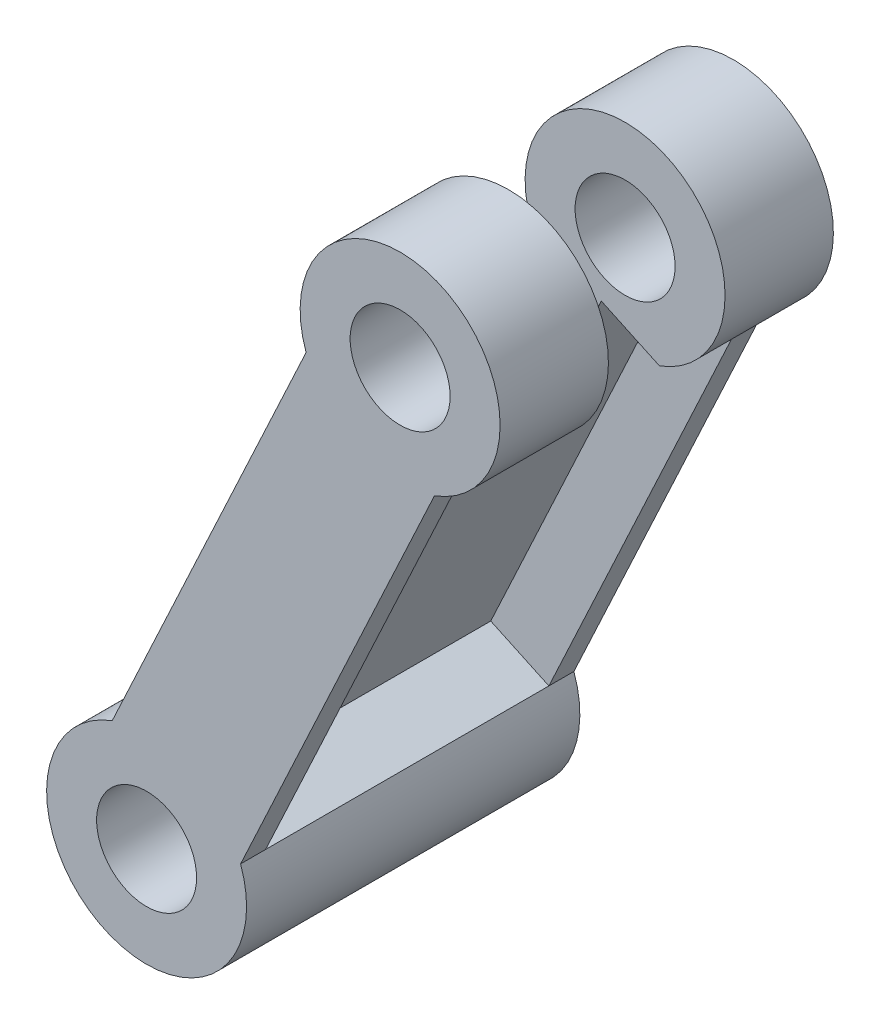
ISO-10303-21;
HEADER;
FILE_DESCRIPTION(('STEP AP214'),'2;1');
FILE_NAME('part.step','',(''),(''),'','','');
FILE_SCHEMA(('AUTOMOTIVE_DESIGN { 1 0 10303 214 1 1 1 1 }'));
ENDSEC;
DATA;
#1=APPLICATION_CONTEXT('core data for automotive mechanical design processes');
#2=APPLICATION_PROTOCOL_DEFINITION('international standard','automotive_design',2000,#1);
#3=PRODUCT_CONTEXT('',#1,'mechanical');
#4=PRODUCT('Part','Part','',(#3));
#5=PRODUCT_RELATED_PRODUCT_CATEGORY('part','',(#4));
#6=PRODUCT_DEFINITION_FORMATION('','',#4);
#7=PRODUCT_DEFINITION_CONTEXT('part definition',#1,'design');
#8=PRODUCT_DEFINITION('design','',#6,#7);
#9=PRODUCT_DEFINITION_SHAPE('','',#8);
#10=(LENGTH_UNIT() NAMED_UNIT(*) SI_UNIT(.MILLI.,.METRE.));
#11=(NAMED_UNIT(*) PLANE_ANGLE_UNIT() SI_UNIT($,.RADIAN.));
#12=(NAMED_UNIT(*) SI_UNIT($,.STERADIAN.) SOLID_ANGLE_UNIT());
#13=UNCERTAINTY_MEASURE_WITH_UNIT(LENGTH_MEASURE(1.E-05),#10,'distance_accuracy_value','');
#14=(GEOMETRIC_REPRESENTATION_CONTEXT(3) GLOBAL_UNCERTAINTY_ASSIGNED_CONTEXT((#13)) GLOBAL_UNIT_ASSIGNED_CONTEXT((#10,
#11,#12)) REPRESENTATION_CONTEXT('',''));
#15=CARTESIAN_POINT('',(0.,0.,0.));
#16=DIRECTION('',(0.,0.,1.));
#17=DIRECTION('',(1.,0.,0.));
#18=AXIS2_PLACEMENT_3D('',#15,#16,#17);
#19=CARTESIAN_POINT('',(38.5180809490576,-17.9612761239796,100.));
#20=DIRECTION('',(0.906307787036651,-0.422618261740697,0.));
#21=DIRECTION('',(0.422618261740697,0.906307787036651,0.));
#22=AXIS2_PLACEMENT_3D('',#19,#20,#21);
#23=PLANE('',#22);
#24=DIRECTION('',(0.,0.,-1.));
#25=VECTOR('',#24,1.);
#26=CARTESIAN_POINT('',(172.76163669529,269.924958207627,100.));
#27=LINE('',#26,#25);
#28=CARTESIAN_POINT('',(172.76163669529,269.924958207627,-85.));
#29=VERTEX_POINT('',#28);
#30=CARTESIAN_POINT('',(172.76163669529,269.924958207627,-100.));
#31=VERTEX_POINT('',#30);
#32=EDGE_CURVE('E339',#29,#31,#27,.T.);
#33=ORIENTED_EDGE('',*,*,#32,.F.);
#34=DIRECTION('',(-0.422618261740697,-0.906307787036651,0.));
#35=VECTOR('',#34,1.);
#36=CARTESIAN_POINT('',(56.4170994294767,20.4232928776077,-85.));
#37=LINE('',#36,#35);
#38=CARTESIAN_POINT('',(56.4170994294767,20.4232928776077,-85.));
#39=VERTEX_POINT('',#38);
#40=EDGE_CURVE('E196',#29,#39,#37,.T.);
#41=ORIENTED_EDGE('',*,*,#40,.T.);
#42=DIRECTION('',(0.,0.,-1.));
#43=VECTOR('',#42,1.);
#44=CARTESIAN_POINT('',(56.4170994294767,20.4232928776077,100.));
#45=LINE('',#44,#43);
#46=CARTESIAN_POINT('',(56.4170994294767,20.4232928776077,-100.));
#47=VERTEX_POINT('',#46);
#48=EDGE_CURVE('E320',#39,#47,#45,.T.);
#49=ORIENTED_EDGE('',*,*,#48,.T.);
#50=DIRECTION('',(-0.422618261740697,-0.906307787036651,0.));
#51=VECTOR('',#50,1.);
#52=CARTESIAN_POINT('',(38.5180809490576,-17.9612761239796,-100.));
#53=LINE('',#52,#51);
#54=EDGE_CURVE('E297',#31,#47,#53,.T.);
#55=ORIENTED_EDGE('',*,*,#54,.F.);
#56=EDGE_LOOP('',(#33,#41,#49,#55));
#57=FACE_BOUND('',#56,.T.);
#58=ADVANCED_FACE('F43',(#57),#23,.T.);
#59=CARTESIAN_POINT('',(56.4170994294767,20.4232928776077,100.));
#60=VERTEX_POINT('',#59);
#61=CARTESIAN_POINT('',(56.4170994294767,20.4232928776077,85.));
#62=VERTEX_POINT('',#61);
#63=EDGE_CURVE('E327',#60,#62,#45,.T.);
#64=ORIENTED_EDGE('',*,*,#63,.T.);
#65=DIRECTION('',(0.422618261740697,0.906307787036651,0.));
#66=VECTOR('',#65,1.);
#67=CARTESIAN_POINT('',(172.76163669529,269.924958207627,85.));
#68=LINE('',#67,#66);
#69=CARTESIAN_POINT('',(172.76163669529,269.924958207627,85.));
#70=VERTEX_POINT('',#69);
#71=EDGE_CURVE('E207',#62,#70,#68,.T.);
#72=ORIENTED_EDGE('',*,*,#71,.T.);
#73=CARTESIAN_POINT('',(172.76163669529,269.924958207627,100.));
#74=VERTEX_POINT('',#73);
#75=EDGE_CURVE('E344',#74,#70,#27,.T.);
#76=ORIENTED_EDGE('',*,*,#75,.F.);
#77=DIRECTION('',(-0.422618261740697,-0.906307787036651,0.));
#78=VECTOR('',#77,1.);
#79=CARTESIAN_POINT('',(38.5180809490576,-17.9612761239796,100.));
#80=LINE('',#79,#78);
#81=EDGE_CURVE('E310',#74,#60,#80,.T.);
#82=ORIENTED_EDGE('',*,*,#81,.T.);
#83=EDGE_LOOP('',(#64,#72,#76,#82));
#84=FACE_BOUND('',#83,.T.);
#85=ADVANCED_FACE('F406',(#84),#23,.T.);
#86=CARTESIAN_POINT('',(152.142574226651,326.270803333194,-35.));
#87=DIRECTION('',(0.,0.,1.));
#88=DIRECTION('',(1.,0.,0.));
#89=AXIS2_PLACEMENT_3D('',#86,#87,#88);
#90=PLANE('',#89);
#91=CARTESIAN_POINT('',(152.142574226651,326.270803333194,-35.));
#92=DIRECTION('',(0.,0.,1.));
#93=DIRECTION('',(1.,0.,0.));
#94=AXIS2_PLACEMENT_3D('',#91,#92,#93);
#95=CIRCLE('',#94,30.);
#96=CARTESIAN_POINT('',(182.142574226651,326.270803333194,-35.));
#97=VERTEX_POINT('',#96);
#98=EDGE_CURVE('E302',#97,#97,#95,.F.);
#99=ORIENTED_EDGE('',*,*,#98,.T.);
#100=EDGE_LOOP('',(#99));
#101=FACE_BOUND('',#100,.T.);
#102=DIRECTION('',(-0.422618261740697,-0.906307787036651,0.));
#103=VECTOR('',#102,1.);
#104=CARTESIAN_POINT('',(155.767805374798,324.580330286232,-35.));
#105=LINE('',#104,#103);
#106=CARTESIAN_POINT('',(137.868786894379,286.195761284644,-35.));
#107=VERTEX_POINT('',#106);
#108=CARTESIAN_POINT('',(118.850965116047,245.411910867995,-35.));
#109=VERTEX_POINT('',#108);
#110=EDGE_CURVE('E60',#107,#109,#105,.T.);
#111=ORIENTED_EDGE('',*,*,#110,.F.);
#112=DIRECTION('',(0.906307787036651,-0.422618261740698,0.));
#113=VECTOR('',#112,1.);
#114=CARTESIAN_POINT('',(134.243555746232,287.886234331607,-35.));
#115=LINE('',#114,#113);
#116=CARTESIAN_POINT('',(172.76163669529,269.924958207627,-35.));
#117=VERTEX_POINT('',#116);
#118=EDGE_CURVE('E184',#107,#117,#115,.T.);
#119=ORIENTED_EDGE('',*,*,#118,.T.);
#120=CARTESIAN_POINT('',(152.142574226651,326.270803333194,-35.));
#121=DIRECTION('',(0.,0.,1.));
#122=DIRECTION('',(1.,0.,0.));
#123=AXIS2_PLACEMENT_3D('',#120,#121,#122);
#124=CIRCLE('',#123,60.);
#125=CARTESIAN_POINT('',(95.7254747971743,305.847510455587,-35.));
#126=VERTEX_POINT('',#125);
#127=EDGE_CURVE('E287',#117,#126,#124,.T.);
#128=ORIENTED_EDGE('',*,*,#127,.T.);
#129=DIRECTION('',(-0.906307787036651,0.422618261740697,0.));
#130=VECTOR('',#129,1.);
#131=CARTESIAN_POINT('',(134.243555746232,287.886234331607,-35.));
#132=LINE('',#131,#130);
#133=CARTESIAN_POINT('',(130.618324598085,289.57670737857,-35.));
#134=VERTEX_POINT('',#133);
#135=EDGE_CURVE('E276',#134,#126,#132,.T.);
#136=ORIENTED_EDGE('',*,*,#135,.F.);
#137=DIRECTION('',(0.422618261740697,0.906307787036651,0.));
#138=VECTOR('',#137,1.);
#139=CARTESIAN_POINT('',(148.517343078504,327.961276380157,-35.));
#140=LINE('',#139,#138);
#141=CARTESIAN_POINT('',(111.600502819754,248.792856961921,-35.));
#142=VERTEX_POINT('',#141);
#143=EDGE_CURVE('E273',#142,#134,#140,.T.);
#144=ORIENTED_EDGE('',*,*,#143,.F.);
#145=DIRECTION('',(-0.906307787036651,0.422618261740697,0.));
#146=VECTOR('',#145,1.);
#147=CARTESIAN_POINT('',(312.459663474745,155.130692137914,-35.));
#148=LINE('',#147,#146);
#149=EDGE_CURVE('E278',#109,#142,#148,.T.);
#150=ORIENTED_EDGE('',*,*,#149,.F.);
#151=EDGE_LOOP('',(#111,#119,#128,#136,#144,#150));
#152=FACE_BOUND('',#151,.T.);
#153=ADVANCED_FACE('F359',(#101,#152),#90,.T.);
#154=CARTESIAN_POINT('',(152.142574226651,326.270803333194,35.));
#155=DIRECTION('',(0.,0.,1.));
#156=DIRECTION('',(1.,0.,0.));
#157=AXIS2_PLACEMENT_3D('',#154,#155,#156);
#158=PLANE('',#157);
#159=CARTESIAN_POINT('',(152.142574226651,326.270803333194,35.));
#160=DIRECTION('',(0.,0.,1.));
#161=DIRECTION('',(1.,0.,0.));
#162=AXIS2_PLACEMENT_3D('',#159,#160,#161);
#163=CIRCLE('',#162,30.);
#164=CARTESIAN_POINT('',(182.142574226651,326.270803333194,35.));
#165=VERTEX_POINT('',#164);
#166=EDGE_CURVE('E290',#165,#165,#163,.F.);
#167=ORIENTED_EDGE('',*,*,#166,.F.);
#168=EDGE_LOOP('',(#167));
#169=FACE_BOUND('',#168,.T.);
#170=DIRECTION('',(0.906307787036651,-0.422618261740698,0.));
#171=VECTOR('',#170,1.);
#172=CARTESIAN_POINT('',(134.243555746232,287.886234331607,35.));
#173=LINE('',#172,#171);
#174=CARTESIAN_POINT('',(137.868786894379,286.195761284644,35.));
#175=VERTEX_POINT('',#174);
#176=CARTESIAN_POINT('',(172.76163669529,269.924958207627,35.));
#177=VERTEX_POINT('',#176);
#178=EDGE_CURVE('E11',#175,#177,#173,.T.);
#179=ORIENTED_EDGE('',*,*,#178,.F.);
#180=DIRECTION('',(-0.422618261740697,-0.906307787036651,0.));
#181=VECTOR('',#180,1.);
#182=CARTESIAN_POINT('',(155.767805374798,324.580330286232,35.));
#183=LINE('',#182,#181);
#184=CARTESIAN_POINT('',(118.850965116047,245.411910867995,35.));
#185=VERTEX_POINT('',#184);
#186=EDGE_CURVE('E230',#175,#185,#183,.T.);
#187=ORIENTED_EDGE('',*,*,#186,.T.);
#188=DIRECTION('',(-0.906307787036651,0.422618261740697,0.));
#189=VECTOR('',#188,1.);
#190=CARTESIAN_POINT('',(312.459663474745,155.130692137914,35.));
#191=LINE('',#190,#189);
#192=CARTESIAN_POINT('',(111.600502819754,248.792856961921,35.));
#193=VERTEX_POINT('',#192);
#194=EDGE_CURVE('E277',#185,#193,#191,.T.);
#195=ORIENTED_EDGE('',*,*,#194,.T.);
#196=DIRECTION('',(0.422618261740697,0.906307787036651,0.));
#197=VECTOR('',#196,1.);
#198=CARTESIAN_POINT('',(148.517343078504,327.961276380157,35.));
#199=LINE('',#198,#197);
#200=CARTESIAN_POINT('',(130.618324598085,289.57670737857,35.));
#201=VERTEX_POINT('',#200);
#202=EDGE_CURVE('E275',#193,#201,#199,.T.);
#203=ORIENTED_EDGE('',*,*,#202,.T.);
#204=DIRECTION('',(-0.906307787036651,0.422618261740697,0.));
#205=VECTOR('',#204,1.);
#206=CARTESIAN_POINT('',(134.243555746232,287.886234331607,35.));
#207=LINE('',#206,#205);
#208=CARTESIAN_POINT('',(95.7254747971743,305.847510455587,35.));
#209=VERTEX_POINT('',#208);
#210=EDGE_CURVE('E352',#201,#209,#207,.T.);
#211=ORIENTED_EDGE('',*,*,#210,.T.);
#212=CARTESIAN_POINT('',(152.142574226651,326.270803333194,35.));
#213=DIRECTION('',(0.,0.,1.));
#214=DIRECTION('',(1.,0.,0.));
#215=AXIS2_PLACEMENT_3D('',#212,#213,#214);
#216=CIRCLE('',#215,60.);
#217=EDGE_CURVE('E285',#177,#209,#216,.T.);
#218=ORIENTED_EDGE('',*,*,#217,.F.);
#219=EDGE_LOOP('',(#179,#187,#195,#203,#211,#218));
#220=FACE_BOUND('',#219,.T.);
#221=ADVANCED_FACE('F388',(#169,#220),#158,.F.);
#222=CARTESIAN_POINT('',(-38.5180809490576,17.9612761239796,100.));
#223=DIRECTION('',(0.906307787036651,-0.422618261740697,0.));
#224=DIRECTION('',(0.422618261740697,0.906307787036651,0.));
#225=AXIS2_PLACEMENT_3D('',#222,#223,#224);
#226=PLANE('',#225);
#227=DIRECTION('',(0.,0.,-1.));
#228=VECTOR('',#227,1.);
#229=CARTESIAN_POINT('',(-20.6190624686386,56.345845125567,100.));
#230=LINE('',#229,#228);
#231=CARTESIAN_POINT('',(-20.6190624686386,56.345845125567,-85.));
#232=VERTEX_POINT('',#231);
#233=CARTESIAN_POINT('',(-20.6190624686386,56.345845125567,-100.));
#234=VERTEX_POINT('',#233);
#235=EDGE_CURVE('E331',#232,#234,#230,.T.);
#236=ORIENTED_EDGE('',*,*,#235,.F.);
#237=DIRECTION('',(-0.422618261740697,-0.906307787036651,0.));
#238=VECTOR('',#237,1.);
#239=CARTESIAN_POINT('',(-20.6190624686386,56.345845125567,-85.));
#240=LINE('',#239,#238);
#241=CARTESIAN_POINT('',(95.7254747971743,305.847510455587,-85.));
#242=VERTEX_POINT('',#241);
#243=EDGE_CURVE('E234',#242,#232,#240,.T.);
#244=ORIENTED_EDGE('',*,*,#243,.F.);
#245=DIRECTION('',(0.,0.,-1.));
#246=VECTOR('',#245,1.);
#247=CARTESIAN_POINT('',(95.7254747971743,305.847510455587,100.));
#248=LINE('',#247,#246);
#249=CARTESIAN_POINT('',(95.7254747971743,305.847510455587,-100.));
#250=VERTEX_POINT('',#249);
#251=EDGE_CURVE('E335',#242,#250,#248,.T.);
#252=ORIENTED_EDGE('',*,*,#251,.T.);
#253=DIRECTION('',(-0.422618261740697,-0.906307787036651,0.));
#254=VECTOR('',#253,1.);
#255=CARTESIAN_POINT('',(-38.5180809490576,17.9612761239796,-100.));
#256=LINE('',#255,#254);
#257=EDGE_CURVE('E325',#250,#234,#256,.T.);
#258=ORIENTED_EDGE('',*,*,#257,.T.);
#259=EDGE_LOOP('',(#236,#244,#252,#258));
#260=FACE_BOUND('',#259,.T.);
#261=ADVANCED_FACE('F426',(#260),#226,.F.);
#262=CARTESIAN_POINT('',(152.142574226651,326.270803333194,100.));
#263=DIRECTION('',(0.,0.,-1.));
#264=DIRECTION('',(-1.,0.,0.));
#265=AXIS2_PLACEMENT_3D('',#262,#263,#264);
#266=CYLINDRICAL_SURFACE('',#265,60.);
#267=ORIENTED_EDGE('',*,*,#127,.F.);
#268=EDGE_CURVE('E342',#117,#29,#27,.T.);
#269=ORIENTED_EDGE('',*,*,#268,.T.);
#270=ORIENTED_EDGE('',*,*,#32,.T.);
#271=CARTESIAN_POINT('',(152.142574226651,326.270803333194,-100.));
#272=DIRECTION('',(0.,0.,1.));
#273=DIRECTION('',(1.,0.,0.));
#274=AXIS2_PLACEMENT_3D('',#271,#272,#273);
#275=CIRCLE('',#274,60.);
#276=EDGE_CURVE('E318',#31,#250,#275,.T.);
#277=ORIENTED_EDGE('',*,*,#276,.T.);
#278=ORIENTED_EDGE('',*,*,#251,.F.);
#279=EDGE_CURVE('E338',#126,#242,#248,.T.);
#280=ORIENTED_EDGE('',*,*,#279,.F.);
#281=EDGE_LOOP('',(#267,#269,#270,#277,#278,#280));
#282=FACE_BOUND('',#281,.T.);
#283=ADVANCED_FACE('F425',(#282),#266,.T.);
#284=CARTESIAN_POINT('',(152.142574226651,326.270803333194,-100.));
#285=DIRECTION('',(0.,0.,1.));
#286=DIRECTION('',(1.,0.,0.));
#287=AXIS2_PLACEMENT_3D('',#284,#285,#286);
#288=CYLINDRICAL_SURFACE('',#287,30.);
#289=CARTESIAN_POINT('',(152.142574226651,326.270803333194,-100.));
#290=DIRECTION('',(0.,0.,1.));
#291=DIRECTION('',(1.,0.,0.));
#292=AXIS2_PLACEMENT_3D('',#289,#290,#291);
#293=CIRCLE('',#292,30.);
#294=CARTESIAN_POINT('',(182.142574226651,326.270803333194,-100.));
#295=VERTEX_POINT('',#294);
#296=EDGE_CURVE('E301',#295,#295,#293,.T.);
#297=ORIENTED_EDGE('',*,*,#296,.F.);
#298=EDGE_LOOP('',(#297));
#299=FACE_BOUND('',#298,.T.);
#300=ORIENTED_EDGE('',*,*,#98,.F.);
#301=EDGE_LOOP('',(#300));
#302=FACE_BOUND('',#301,.T.);
#303=ADVANCED_FACE('F480',(#299,#302),#288,.F.);
#304=ORIENTED_EDGE('',*,*,#75,.T.);
#305=DIRECTION('',(0.,0.,-1.));
#306=VECTOR('',#305,1.);
#307=CARTESIAN_POINT('',(172.76163669529,269.924958207627,-85.));
#308=LINE('',#307,#306);
#309=EDGE_CURVE('E213',#70,#177,#308,.T.);
#310=ORIENTED_EDGE('',*,*,#309,.T.);
#311=ORIENTED_EDGE('',*,*,#217,.T.);
#312=DIRECTION('',(0.,0.,-1.));
#313=VECTOR('',#312,1.);
#314=CARTESIAN_POINT('',(95.7254747971743,305.847510455587,-85.));
#315=LINE('',#314,#313);
#316=CARTESIAN_POINT('',(95.7254747971743,305.847510455587,85.));
#317=VERTEX_POINT('',#316);
#318=EDGE_CURVE('E237',#317,#209,#315,.T.);
#319=ORIENTED_EDGE('',*,*,#318,.F.);
#320=CARTESIAN_POINT('',(95.7254747971743,305.847510455587,100.));
#321=VERTEX_POINT('',#320);
#322=EDGE_CURVE('E337',#321,#317,#248,.T.);
#323=ORIENTED_EDGE('',*,*,#322,.F.);
#324=CARTESIAN_POINT('',(152.142574226651,326.270803333194,100.));
#325=DIRECTION('',(0.,0.,1.));
#326=DIRECTION('',(1.,0.,0.));
#327=AXIS2_PLACEMENT_3D('',#324,#325,#326);
#328=CIRCLE('',#327,60.);
#329=EDGE_CURVE('E309',#74,#321,#328,.T.);
#330=ORIENTED_EDGE('',*,*,#329,.F.);
#331=EDGE_LOOP('',(#304,#310,#311,#319,#323,#330));
#332=FACE_BOUND('',#331,.T.);
#333=ADVANCED_FACE('F405',(#332),#266,.T.);
#334=ORIENTED_EDGE('',*,*,#322,.T.);
#335=DIRECTION('',(0.422618261740697,0.906307787036651,0.));
#336=VECTOR('',#335,1.);
#337=CARTESIAN_POINT('',(95.7254747971743,305.847510455587,85.));
#338=LINE('',#337,#336);
#339=CARTESIAN_POINT('',(-20.6190624686386,56.345845125567,85.));
#340=VERTEX_POINT('',#339);
#341=EDGE_CURVE('E253',#340,#317,#338,.T.);
#342=ORIENTED_EDGE('',*,*,#341,.F.);
#343=CARTESIAN_POINT('',(-20.6190624686386,56.345845125567,100.));
#344=VERTEX_POINT('',#343);
#345=EDGE_CURVE('E332',#344,#340,#230,.T.);
#346=ORIENTED_EDGE('',*,*,#345,.F.);
#347=DIRECTION('',(-0.422618261740697,-0.906307787036651,0.));
#348=VECTOR('',#347,1.);
#349=CARTESIAN_POINT('',(-38.5180809490576,17.9612761239796,100.));
#350=LINE('',#349,#348);
#351=EDGE_CURVE('E312',#321,#344,#350,.T.);
#352=ORIENTED_EDGE('',*,*,#351,.F.);
#353=EDGE_LOOP('',(#334,#342,#346,#352));
#354=FACE_BOUND('',#353,.T.);
#355=ADVANCED_FACE('F436',(#354),#226,.F.);
#356=CARTESIAN_POINT('',(0.,0.,100.));
#357=DIRECTION('',(0.,0.,-1.));
#358=DIRECTION('',(-1.,0.,0.));
#359=AXIS2_PLACEMENT_3D('',#356,#357,#358);
#360=CYLINDRICAL_SURFACE('',#359,60.);
#361=CARTESIAN_POINT('',(0.,0.,-100.));
#362=DIRECTION('',(0.,0.,1.));
#363=DIRECTION('',(1.,0.,0.));
#364=AXIS2_PLACEMENT_3D('',#361,#362,#363);
#365=CIRCLE('',#364,60.);
#366=EDGE_CURVE('E311',#234,#47,#365,.T.);
#367=ORIENTED_EDGE('',*,*,#366,.T.);
#368=ORIENTED_EDGE('',*,*,#48,.F.);
#369=DIRECTION('',(0.,0.,1.));
#370=VECTOR('',#369,1.);
#371=CARTESIAN_POINT('',(56.4170994294767,20.4232928776077,85.));
#372=LINE('',#371,#370);
#373=EDGE_CURVE('E204',#39,#62,#372,.T.);
#374=ORIENTED_EDGE('',*,*,#373,.T.);
#375=ORIENTED_EDGE('',*,*,#63,.F.);
#376=CARTESIAN_POINT('',(0.,0.,100.));
#377=DIRECTION('',(0.,0.,1.));
#378=DIRECTION('',(1.,0.,0.));
#379=AXIS2_PLACEMENT_3D('',#376,#377,#378);
#380=CIRCLE('',#379,60.);
#381=EDGE_CURVE('E314',#344,#60,#380,.T.);
#382=ORIENTED_EDGE('',*,*,#381,.F.);
#383=ORIENTED_EDGE('',*,*,#345,.T.);
#384=DIRECTION('',(0.,0.,1.));
#385=VECTOR('',#384,1.);
#386=CARTESIAN_POINT('',(-20.6190624686386,56.345845125567,85.));
#387=LINE('',#386,#385);
#388=EDGE_CURVE('E255',#232,#340,#387,.T.);
#389=ORIENTED_EDGE('',*,*,#388,.F.);
#390=ORIENTED_EDGE('',*,*,#235,.T.);
#391=EDGE_LOOP('',(#367,#368,#374,#375,#382,#383,#389,#390));
#392=FACE_BOUND('',#391,.T.);
#393=ADVANCED_FACE('F413',(#392),#360,.T.);
#394=CARTESIAN_POINT('',(0.,0.,100.));
#395=DIRECTION('',(0.,0.,1.));
#396=DIRECTION('',(1.,0.,0.));
#397=AXIS2_PLACEMENT_3D('',#394,#395,#396);
#398=PLANE('',#397);
#399=CARTESIAN_POINT('',(0.,0.,100.));
#400=DIRECTION('',(0.,0.,1.));
#401=DIRECTION('',(1.,0.,0.));
#402=AXIS2_PLACEMENT_3D('',#399,#400,#401);
#403=CIRCLE('',#402,30.);
#404=CARTESIAN_POINT('',(30.,0.,100.));
#405=VERTEX_POINT('',#404);
#406=EDGE_CURVE('E291',#405,#405,#403,.T.);
#407=ORIENTED_EDGE('',*,*,#406,.F.);
#408=EDGE_LOOP('',(#407));
#409=FACE_BOUND('',#408,.T.);
#410=CARTESIAN_POINT('',(152.142574226651,326.270803333194,100.));
#411=DIRECTION('',(0.,0.,1.));
#412=DIRECTION('',(1.,0.,0.));
#413=AXIS2_PLACEMENT_3D('',#410,#411,#412);
#414=CIRCLE('',#413,30.);
#415=CARTESIAN_POINT('',(182.142574226651,326.270803333194,100.));
#416=VERTEX_POINT('',#415);
#417=EDGE_CURVE('E300',#416,#416,#414,.T.);
#418=ORIENTED_EDGE('',*,*,#417,.F.);
#419=EDGE_LOOP('',(#418));
#420=FACE_BOUND('',#419,.T.);
#421=ORIENTED_EDGE('',*,*,#81,.F.);
#422=ORIENTED_EDGE('',*,*,#329,.T.);
#423=ORIENTED_EDGE('',*,*,#351,.T.);
#424=ORIENTED_EDGE('',*,*,#381,.T.);
#425=EDGE_LOOP('',(#421,#422,#423,#424));
#426=FACE_BOUND('',#425,.T.);
#427=ADVANCED_FACE('F437',(#409,#420,#426),#398,.T.);
#428=CARTESIAN_POINT('',(0.,0.,-100.));
#429=DIRECTION('',(0.,0.,1.));
#430=DIRECTION('',(1.,0.,0.));
#431=AXIS2_PLACEMENT_3D('',#428,#429,#430);
#432=PLANE('',#431);
#433=CARTESIAN_POINT('',(0.,0.,-100.));
#434=DIRECTION('',(0.,0.,1.));
#435=DIRECTION('',(1.,0.,0.));
#436=AXIS2_PLACEMENT_3D('',#433,#434,#435);
#437=CIRCLE('',#436,30.);
#438=CARTESIAN_POINT('',(30.,0.,-100.));
#439=VERTEX_POINT('',#438);
#440=EDGE_CURVE('E298',#439,#439,#437,.T.);
#441=ORIENTED_EDGE('',*,*,#440,.T.);
#442=EDGE_LOOP('',(#441));
#443=FACE_BOUND('',#442,.T.);
#444=ORIENTED_EDGE('',*,*,#296,.T.);
#445=EDGE_LOOP('',(#444));
#446=FACE_BOUND('',#445,.T.);
#447=ORIENTED_EDGE('',*,*,#54,.T.);
#448=ORIENTED_EDGE('',*,*,#366,.F.);
#449=ORIENTED_EDGE('',*,*,#257,.F.);
#450=ORIENTED_EDGE('',*,*,#276,.F.);
#451=EDGE_LOOP('',(#447,#448,#449,#450));
#452=FACE_BOUND('',#451,.T.);
#453=ADVANCED_FACE('F435',(#443,#446,#452),#432,.F.);
#454=ORIENTED_EDGE('',*,*,#166,.T.);
#455=EDGE_LOOP('',(#454));
#456=FACE_BOUND('',#455,.T.);
#457=ORIENTED_EDGE('',*,*,#417,.T.);
#458=EDGE_LOOP('',(#457));
#459=FACE_BOUND('',#458,.T.);
#460=ADVANCED_FACE('F447',(#456,#459),#288,.F.);
#461=CARTESIAN_POINT('',(0.,0.,-100.));
#462=DIRECTION('',(0.,0.,1.));
#463=DIRECTION('',(1.,0.,0.));
#464=AXIS2_PLACEMENT_3D('',#461,#462,#463);
#465=CYLINDRICAL_SURFACE('',#464,30.);
#466=ORIENTED_EDGE('',*,*,#440,.F.);
#467=EDGE_LOOP('',(#466));
#468=FACE_BOUND('',#467,.T.);
#469=ORIENTED_EDGE('',*,*,#406,.T.);
#470=EDGE_LOOP('',(#469));
#471=FACE_BOUND('',#470,.T.);
#472=ADVANCED_FACE('F471',(#468,#471),#465,.F.);
#473=CARTESIAN_POINT('',(312.459663474745,155.130692137914,25.));
#474=DIRECTION('',(-0.906307787036651,0.422618261740697,0.));
#475=DIRECTION('',(-0.422618261740697,-0.906307787036651,0.));
#476=AXIS2_PLACEMENT_3D('',#473,#474,#475);
#477=CYLINDRICAL_SURFACE('',#476,10.);
#478=ORIENTED_EDGE('',*,*,#194,.F.);
#479=CARTESIAN_POINT('',(118.850965116047,245.411910867995,25.));
#480=DIRECTION('',(-0.906307787036651,0.422618261740697,0.));
#481=DIRECTION('',(-0.422618261740697,-0.906307787036651,0.));
#482=AXIS2_PLACEMENT_3D('',#479,#480,#481);
#483=CIRCLE('',#482,10.);
#484=CARTESIAN_POINT('',(114.62478249864,236.348832997628,24.9999999999999));
#485=VERTEX_POINT('',#484);
#486=EDGE_CURVE('E228',#185,#485,#483,.F.);
#487=ORIENTED_EDGE('',*,*,#486,.T.);
#488=DIRECTION('',(-0.906307787036651,0.422618261740697,0.));
#489=VECTOR('',#488,1.);
#490=CARTESIAN_POINT('',(308.233480857338,146.067614267547,24.9999999999999));
#491=LINE('',#490,#489);
#492=CARTESIAN_POINT('',(107.374320202347,239.729779091554,24.9999999999999));
#493=VERTEX_POINT('',#492);
#494=EDGE_CURVE('E282',#485,#493,#491,.T.);
#495=ORIENTED_EDGE('',*,*,#494,.T.);
#496=CARTESIAN_POINT('',(111.600502819754,248.792856961921,25.));
#497=DIRECTION('',(0.906307787036651,-0.422618261740697,0.));
#498=DIRECTION('',(0.422618261740697,0.906307787036651,0.));
#499=AXIS2_PLACEMENT_3D('',#496,#497,#498);
#500=CIRCLE('',#499,10.);
#501=EDGE_CURVE('E268',#493,#193,#500,.F.);
#502=ORIENTED_EDGE('',*,*,#501,.T.);
#503=EDGE_LOOP('',(#478,#487,#495,#502));
#504=FACE_BOUND('',#503,.T.);
#505=ADVANCED_FACE('F392',(#504),#477,.F.);
#506=CARTESIAN_POINT('',(308.233480857338,146.067614267547,24.9999999999999));
#507=DIRECTION('',(-0.422618261740697,-0.906307787036651,0.));
#508=DIRECTION('',(0.906307787036651,-0.422618261740697,0.));
#509=AXIS2_PLACEMENT_3D('',#506,#507,#508);
#510=PLANE('',#509);
#511=ORIENTED_EDGE('',*,*,#494,.F.);
#512=DIRECTION('',(0.,0.,-1.));
#513=VECTOR('',#512,1.);
#514=CARTESIAN_POINT('',(114.62478249864,236.348832997628,24.9999999999999));
#515=LINE('',#514,#513);
#516=CARTESIAN_POINT('',(114.62478249864,236.348832997628,-25.));
#517=VERTEX_POINT('',#516);
#518=EDGE_CURVE('E221',#485,#517,#515,.T.);
#519=ORIENTED_EDGE('',*,*,#518,.T.);
#520=DIRECTION('',(-0.906307787036651,0.422618261740697,0.));
#521=VECTOR('',#520,1.);
#522=CARTESIAN_POINT('',(308.233480857338,146.067614267547,-25.));
#523=LINE('',#522,#521);
#524=CARTESIAN_POINT('',(107.374320202347,239.729779091554,-25.));
#525=VERTEX_POINT('',#524);
#526=EDGE_CURVE('E62',#517,#525,#523,.T.);
#527=ORIENTED_EDGE('',*,*,#526,.T.);
#528=DIRECTION('',(0.,0.,1.));
#529=VECTOR('',#528,1.);
#530=CARTESIAN_POINT('',(107.374320202347,239.729779091554,24.9999999999999));
#531=LINE('',#530,#529);
#532=EDGE_CURVE('E265',#525,#493,#531,.T.);
#533=ORIENTED_EDGE('',*,*,#532,.T.);
#534=EDGE_LOOP('',(#511,#519,#527,#533));
#535=FACE_BOUND('',#534,.T.);
#536=ADVANCED_FACE('F394',(#535),#510,.F.);
#537=CARTESIAN_POINT('',(312.459663474745,155.130692137914,-25.));
#538=DIRECTION('',(-0.906307787036651,0.422618261740697,0.));
#539=DIRECTION('',(-0.422618261740697,-0.906307787036651,0.));
#540=AXIS2_PLACEMENT_3D('',#537,#538,#539);
#541=CYLINDRICAL_SURFACE('',#540,10.);
#542=ORIENTED_EDGE('',*,*,#526,.F.);
#543=CARTESIAN_POINT('',(118.850965116047,245.411910867995,-25.));
#544=DIRECTION('',(-0.906307787036651,0.422618261740697,0.));
#545=DIRECTION('',(-0.422618261740697,-0.906307787036651,0.));
#546=AXIS2_PLACEMENT_3D('',#543,#544,#545);
#547=CIRCLE('',#546,10.);
#548=EDGE_CURVE('E49',#517,#109,#547,.F.);
#549=ORIENTED_EDGE('',*,*,#548,.T.);
#550=ORIENTED_EDGE('',*,*,#149,.T.);
#551=CARTESIAN_POINT('',(111.600502819754,248.792856961921,-25.));
#552=DIRECTION('',(0.906307787036651,-0.422618261740697,0.));
#553=DIRECTION('',(0.422618261740697,0.906307787036651,0.));
#554=AXIS2_PLACEMENT_3D('',#551,#552,#553);
#555=CIRCLE('',#554,10.);
#556=EDGE_CURVE('E343',#142,#525,#555,.F.);
#557=ORIENTED_EDGE('',*,*,#556,.T.);
#558=EDGE_LOOP('',(#542,#549,#550,#557));
#559=FACE_BOUND('',#558,.T.);
#560=ADVANCED_FACE('F358',(#559),#541,.F.);
#561=CARTESIAN_POINT('',(130.618324598085,289.57670737857,-85.));
#562=DIRECTION('',(0.422618261740697,0.906307787036651,0.));
#563=DIRECTION('',(-0.906307787036651,0.422618261740697,0.));
#564=AXIS2_PLACEMENT_3D('',#561,#562,#563);
#565=PLANE('',#564);
#566=DIRECTION('',(0.,0.,-1.));
#567=VECTOR('',#566,1.);
#568=CARTESIAN_POINT('',(130.618324598085,289.57670737857,-85.));
#569=LINE('',#568,#567);
#570=CARTESIAN_POINT('',(130.618324598085,289.57670737857,85.));
#571=VERTEX_POINT('',#570);
#572=EDGE_CURVE('E246',#571,#201,#569,.T.);
#573=ORIENTED_EDGE('',*,*,#572,.F.);
#574=DIRECTION('',(-0.906307787036651,0.422618261740697,0.));
#575=VECTOR('',#574,1.);
#576=CARTESIAN_POINT('',(130.618324598085,289.57670737857,85.));
#577=LINE('',#576,#575);
#578=EDGE_CURVE('E262',#571,#317,#577,.T.);
#579=ORIENTED_EDGE('',*,*,#578,.T.);
#580=ORIENTED_EDGE('',*,*,#318,.T.);
#581=ORIENTED_EDGE('',*,*,#210,.F.);
#582=EDGE_LOOP('',(#573,#579,#580,#581));
#583=FACE_BOUND('',#582,.T.);
#584=ADVANCED_FACE('F381',(#583),#565,.F.);
#585=CARTESIAN_POINT('',(14.2737873322724,40.0750420485501,-85.));
#586=DIRECTION('',(0.,0.,-1.));
#587=DIRECTION('',(0.,1.,0.));
#588=AXIS2_PLACEMENT_3D('',#585,#586,#587);
#589=PLANE('',#588);
#590=ORIENTED_EDGE('',*,*,#243,.T.);
#591=DIRECTION('',(-0.906307787036651,0.422618261740697,0.));
#592=VECTOR('',#591,1.);
#593=CARTESIAN_POINT('',(14.2737873322724,40.0750420485501,-85.));
#594=LINE('',#593,#592);
#595=CARTESIAN_POINT('',(14.2737873322724,40.0750420485501,-85.));
#596=VERTEX_POINT('',#595);
#597=EDGE_CURVE('E248',#596,#232,#594,.T.);
#598=ORIENTED_EDGE('',*,*,#597,.F.);
#599=DIRECTION('',(-0.422618261740697,-0.906307787036651,0.));
#600=VECTOR('',#599,1.);
#601=CARTESIAN_POINT('',(14.2737873322724,40.0750420485501,-85.));
#602=LINE('',#601,#600);
#603=CARTESIAN_POINT('',(130.618324598085,289.57670737857,-85.));
#604=VERTEX_POINT('',#603);
#605=EDGE_CURVE('E232',#604,#596,#602,.T.);
#606=ORIENTED_EDGE('',*,*,#605,.F.);
#607=DIRECTION('',(-0.906307787036651,0.422618261740697,0.));
#608=VECTOR('',#607,1.);
#609=CARTESIAN_POINT('',(130.618324598085,289.57670737857,-85.));
#610=LINE('',#609,#608);
#611=EDGE_CURVE('E258',#604,#242,#610,.T.);
#612=ORIENTED_EDGE('',*,*,#611,.T.);
#613=EDGE_LOOP('',(#590,#598,#606,#612));
#614=FACE_BOUND('',#613,.T.);
#615=ADVANCED_FACE('F375',(#614),#589,.F.);
#616=ORIENTED_EDGE('',*,*,#135,.T.);
#617=ORIENTED_EDGE('',*,*,#279,.T.);
#618=ORIENTED_EDGE('',*,*,#611,.F.);
#619=EDGE_CURVE('E244',#134,#604,#569,.T.);
#620=ORIENTED_EDGE('',*,*,#619,.F.);
#621=EDGE_LOOP('',(#616,#617,#618,#620));
#622=FACE_BOUND('',#621,.T.);
#623=ADVANCED_FACE('F370',(#622),#565,.F.);
#624=CARTESIAN_POINT('',(130.618324598085,289.57670737857,85.));
#625=DIRECTION('',(0.,0.,1.));
#626=DIRECTION('',(0.,-1.,0.));
#627=AXIS2_PLACEMENT_3D('',#624,#625,#626);
#628=PLANE('',#627);
#629=ORIENTED_EDGE('',*,*,#341,.T.);
#630=ORIENTED_EDGE('',*,*,#578,.F.);
#631=DIRECTION('',(0.422618261740697,0.906307787036651,0.));
#632=VECTOR('',#631,1.);
#633=CARTESIAN_POINT('',(130.618324598085,289.57670737857,85.));
#634=LINE('',#633,#632);
#635=CARTESIAN_POINT('',(14.2737873322724,40.0750420485501,85.));
#636=VERTEX_POINT('',#635);
#637=EDGE_CURVE('E245',#636,#571,#634,.T.);
#638=ORIENTED_EDGE('',*,*,#637,.F.);
#639=DIRECTION('',(-0.906307787036651,0.422618261740697,0.));
#640=VECTOR('',#639,1.);
#641=CARTESIAN_POINT('',(14.2737873322724,40.0750420485501,85.));
#642=LINE('',#641,#640);
#643=EDGE_CURVE('E264',#636,#340,#642,.T.);
#644=ORIENTED_EDGE('',*,*,#643,.T.);
#645=EDGE_LOOP('',(#629,#630,#638,#644));
#646=FACE_BOUND('',#645,.T.);
#647=ADVANCED_FACE('F382',(#646),#628,.F.);
#648=CARTESIAN_POINT('',(14.2737873322724,40.0750420485501,85.));
#649=DIRECTION('',(-0.422618261740697,-0.906307787036651,0.));
#650=DIRECTION('',(0.906307787036651,-0.422618261740697,0.));
#651=AXIS2_PLACEMENT_3D('',#648,#649,#650);
#652=PLANE('',#651);
#653=ORIENTED_EDGE('',*,*,#388,.T.);
#654=ORIENTED_EDGE('',*,*,#643,.F.);
#655=DIRECTION('',(0.,0.,1.));
#656=VECTOR('',#655,1.);
#657=CARTESIAN_POINT('',(14.2737873322724,40.0750420485501,85.));
#658=LINE('',#657,#656);
#659=EDGE_CURVE('E238',#596,#636,#658,.T.);
#660=ORIENTED_EDGE('',*,*,#659,.F.);
#661=ORIENTED_EDGE('',*,*,#597,.T.);
#662=EDGE_LOOP('',(#653,#654,#660,#661));
#663=FACE_BOUND('',#662,.T.);
#664=ADVANCED_FACE('F380',(#663),#652,.F.);
#665=CARTESIAN_POINT('',(-3.62523114814661,1.69047304696279,0.));
#666=DIRECTION('',(0.906307787036651,-0.422618261740697,0.));
#667=DIRECTION('',(0.422618261740697,0.906307787036651,0.));
#668=AXIS2_PLACEMENT_3D('',#665,#666,#667);
#669=PLANE('',#668);
#670=ORIENTED_EDGE('',*,*,#143,.T.);
#671=ORIENTED_EDGE('',*,*,#619,.T.);
#672=ORIENTED_EDGE('',*,*,#605,.T.);
#673=ORIENTED_EDGE('',*,*,#659,.T.);
#674=ORIENTED_EDGE('',*,*,#637,.T.);
#675=ORIENTED_EDGE('',*,*,#572,.T.);
#676=ORIENTED_EDGE('',*,*,#202,.F.);
#677=ORIENTED_EDGE('',*,*,#501,.F.);
#678=ORIENTED_EDGE('',*,*,#532,.F.);
#679=ORIENTED_EDGE('',*,*,#556,.F.);
#680=EDGE_LOOP('',(#670,#671,#672,#673,#674,#675,#676,#677,#678,#679));
#681=FACE_BOUND('',#680,.T.);
#682=ADVANCED_FACE('F364',(#681),#669,.F.);
#683=CARTESIAN_POINT('',(137.868786894379,286.195761284644,-85.));
#684=DIRECTION('',(-0.422618261740697,-0.906307787036651,0.));
#685=DIRECTION('',(0.906307787036651,-0.422618261740698,0.));
#686=AXIS2_PLACEMENT_3D('',#683,#684,#685);
#687=PLANE('',#686);
#688=ORIENTED_EDGE('',*,*,#178,.T.);
#689=ORIENTED_EDGE('',*,*,#309,.F.);
#690=DIRECTION('',(0.906307787036651,-0.422618261740697,0.));
#691=VECTOR('',#690,1.);
#692=CARTESIAN_POINT('',(137.868786894379,286.195761284644,85.));
#693=LINE('',#692,#691);
#694=CARTESIAN_POINT('',(137.868786894379,286.195761284644,85.));
#695=VERTEX_POINT('',#694);
#696=EDGE_CURVE('E197',#695,#70,#693,.T.);
#697=ORIENTED_EDGE('',*,*,#696,.F.);
#698=DIRECTION('',(0.,0.,-1.));
#699=VECTOR('',#698,1.);
#700=CARTESIAN_POINT('',(137.868786894379,286.195761284644,-85.));
#701=LINE('',#700,#699);
#702=EDGE_CURVE('E190',#695,#175,#701,.T.);
#703=ORIENTED_EDGE('',*,*,#702,.T.);
#704=EDGE_LOOP('',(#688,#689,#697,#703));
#705=FACE_BOUND('',#704,.T.);
#706=ADVANCED_FACE('F398',(#705),#687,.T.);
#707=CARTESIAN_POINT('',(21.5242496285656,36.6940959546246,-85.));
#708=DIRECTION('',(0.,0.,1.));
#709=DIRECTION('',(0.,-1.,0.));
#710=AXIS2_PLACEMENT_3D('',#707,#708,#709);
#711=PLANE('',#710);
#712=ORIENTED_EDGE('',*,*,#40,.F.);
#713=DIRECTION('',(0.906307787036651,-0.422618261740697,0.));
#714=VECTOR('',#713,1.);
#715=CARTESIAN_POINT('',(137.868786894379,286.195761284644,-85.));
#716=LINE('',#715,#714);
#717=CARTESIAN_POINT('',(137.868786894379,286.195761284644,-85.));
#718=VERTEX_POINT('',#717);
#719=EDGE_CURVE('E185',#718,#29,#716,.T.);
#720=ORIENTED_EDGE('',*,*,#719,.F.);
#721=DIRECTION('',(-0.422618261740697,-0.906307787036651,0.));
#722=VECTOR('',#721,1.);
#723=CARTESIAN_POINT('',(21.5242496285656,36.6940959546246,-85.));
#724=LINE('',#723,#722);
#725=CARTESIAN_POINT('',(21.5242496285656,36.6940959546246,-85.));
#726=VERTEX_POINT('',#725);
#727=EDGE_CURVE('E189',#718,#726,#724,.T.);
#728=ORIENTED_EDGE('',*,*,#727,.T.);
#729=DIRECTION('',(0.906307787036651,-0.422618261740697,0.));
#730=VECTOR('',#729,1.);
#731=CARTESIAN_POINT('',(21.5242496285656,36.6940959546246,-85.));
#732=LINE('',#731,#730);
#733=EDGE_CURVE('E218',#726,#39,#732,.T.);
#734=ORIENTED_EDGE('',*,*,#733,.T.);
#735=EDGE_LOOP('',(#712,#720,#728,#734));
#736=FACE_BOUND('',#735,.T.);
#737=ADVANCED_FACE('F191',(#736),#711,.T.);
#738=CARTESIAN_POINT('',(21.5242496285656,36.6940959546246,85.));
#739=DIRECTION('',(0.422618261740697,0.906307787036651,0.));
#740=DIRECTION('',(-0.906307787036651,0.422618261740698,0.));
#741=AXIS2_PLACEMENT_3D('',#738,#739,#740);
#742=PLANE('',#741);
#743=ORIENTED_EDGE('',*,*,#373,.F.);
#744=ORIENTED_EDGE('',*,*,#733,.F.);
#745=DIRECTION('',(0.,0.,1.));
#746=VECTOR('',#745,1.);
#747=CARTESIAN_POINT('',(21.5242496285656,36.6940959546246,85.));
#748=LINE('',#747,#746);
#749=CARTESIAN_POINT('',(21.5242496285656,36.6940959546246,85.));
#750=VERTEX_POINT('',#749);
#751=EDGE_CURVE('E198',#726,#750,#748,.T.);
#752=ORIENTED_EDGE('',*,*,#751,.T.);
#753=DIRECTION('',(0.906307787036651,-0.422618261740697,0.));
#754=VECTOR('',#753,1.);
#755=CARTESIAN_POINT('',(21.5242496285656,36.6940959546246,85.));
#756=LINE('',#755,#754);
#757=EDGE_CURVE('E222',#750,#62,#756,.T.);
#758=ORIENTED_EDGE('',*,*,#757,.T.);
#759=EDGE_LOOP('',(#743,#744,#752,#758));
#760=FACE_BOUND('',#759,.T.);
#761=ADVANCED_FACE('F417',(#760),#742,.T.);
#762=CARTESIAN_POINT('',(137.868786894379,286.195761284644,85.));
#763=DIRECTION('',(0.,0.,-1.));
#764=DIRECTION('',(0.,1.,0.));
#765=AXIS2_PLACEMENT_3D('',#762,#763,#764);
#766=PLANE('',#765);
#767=ORIENTED_EDGE('',*,*,#71,.F.);
#768=ORIENTED_EDGE('',*,*,#757,.F.);
#769=DIRECTION('',(0.422618261740697,0.906307787036651,0.));
#770=VECTOR('',#769,1.);
#771=CARTESIAN_POINT('',(137.868786894379,286.195761284644,85.));
#772=LINE('',#771,#770);
#773=EDGE_CURVE('E208',#750,#695,#772,.T.);
#774=ORIENTED_EDGE('',*,*,#773,.T.);
#775=ORIENTED_EDGE('',*,*,#696,.T.);
#776=EDGE_LOOP('',(#767,#768,#774,#775));
#777=FACE_BOUND('',#776,.T.);
#778=ADVANCED_FACE('F411',(#777),#766,.T.);
#779=EDGE_CURVE('E177',#107,#718,#701,.T.);
#780=ORIENTED_EDGE('',*,*,#779,.T.);
#781=ORIENTED_EDGE('',*,*,#719,.T.);
#782=ORIENTED_EDGE('',*,*,#268,.F.);
#783=ORIENTED_EDGE('',*,*,#118,.F.);
#784=EDGE_LOOP('',(#780,#781,#782,#783));
#785=FACE_BOUND('',#784,.T.);
#786=ADVANCED_FACE('F181',(#785),#687,.T.);
#787=CARTESIAN_POINT('',(3.62523114814661,-1.69047304696278,0.));
#788=DIRECTION('',(-0.906307787036651,0.422618261740697,0.));
#789=DIRECTION('',(0.422618261740697,0.906307787036651,0.));
#790=AXIS2_PLACEMENT_3D('',#787,#788,#789);
#791=PLANE('',#790);
#792=ORIENTED_EDGE('',*,*,#110,.T.);
#793=ORIENTED_EDGE('',*,*,#548,.F.);
#794=ORIENTED_EDGE('',*,*,#518,.F.);
#795=ORIENTED_EDGE('',*,*,#486,.F.);
#796=ORIENTED_EDGE('',*,*,#186,.F.);
#797=ORIENTED_EDGE('',*,*,#702,.F.);
#798=ORIENTED_EDGE('',*,*,#773,.F.);
#799=ORIENTED_EDGE('',*,*,#751,.F.);
#800=ORIENTED_EDGE('',*,*,#727,.F.);
#801=ORIENTED_EDGE('',*,*,#779,.F.);
#802=EDGE_LOOP('',(#792,#793,#794,#795,#796,#797,#798,#799,#800,#801));
#803=FACE_BOUND('',#802,.T.);
#804=ADVANCED_FACE('F201',(#803),#791,.F.);
#805=CLOSED_SHELL('',(#58,#85,#153,#221,#261,#283,#303,#333,#355,#393,#427,#453,#460,#472,#505,
#536,#560,#584,#615,#623,#647,#664,#682,#706,#737,#761,#778,#786,#804));
#806=MANIFOLD_SOLID_BREP('B2',#805);
#807=ADVANCED_BREP_SHAPE_REPRESENTATION('',(#18,#806),#14);
#808=SHAPE_DEFINITION_REPRESENTATION(#9,#807);
ENDSEC;
END-ISO-10303-21;
